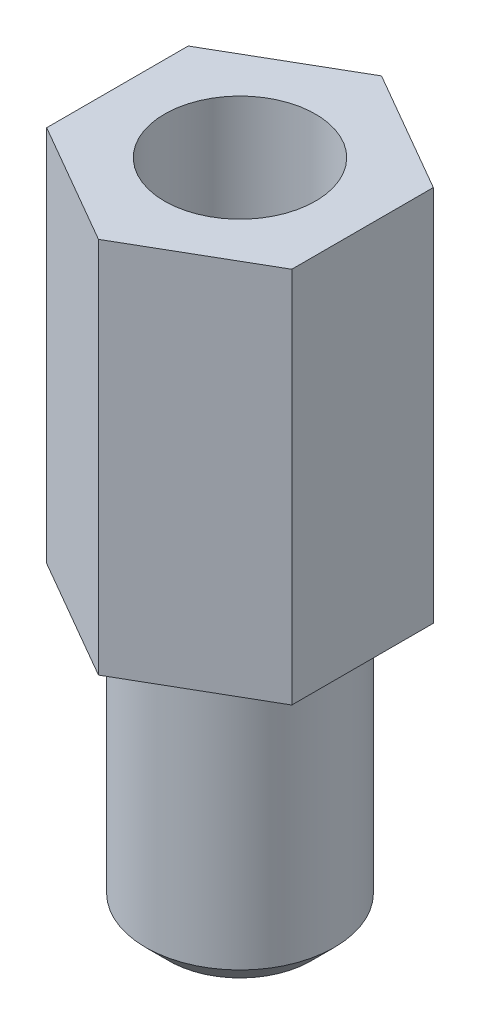
ISO-10303-21;
HEADER;
FILE_DESCRIPTION(('STEP AP214'),'2;1');
FILE_NAME('part.step','',(''),(''),'','','');
FILE_SCHEMA(('AUTOMOTIVE_DESIGN { 1 0 10303 214 1 1 1 1 }'));
ENDSEC;
DATA;
#1=APPLICATION_CONTEXT('core data for automotive mechanical design processes');
#2=APPLICATION_PROTOCOL_DEFINITION('international standard','automotive_design',2000,#1);
#3=PRODUCT_CONTEXT('',#1,'mechanical');
#4=PRODUCT('Part','Part','',(#3));
#5=PRODUCT_RELATED_PRODUCT_CATEGORY('part','',(#4));
#6=PRODUCT_DEFINITION_FORMATION('','',#4);
#7=PRODUCT_DEFINITION_CONTEXT('part definition',#1,'design');
#8=PRODUCT_DEFINITION('design','',#6,#7);
#9=PRODUCT_DEFINITION_SHAPE('','',#8);
#10=(LENGTH_UNIT() NAMED_UNIT(*) SI_UNIT(.MILLI.,.METRE.));
#11=(NAMED_UNIT(*) PLANE_ANGLE_UNIT() SI_UNIT($,.RADIAN.));
#12=(NAMED_UNIT(*) SI_UNIT($,.STERADIAN.) SOLID_ANGLE_UNIT());
#13=UNCERTAINTY_MEASURE_WITH_UNIT(LENGTH_MEASURE(1.E-05),#10,'distance_accuracy_value','');
#14=(GEOMETRIC_REPRESENTATION_CONTEXT(3) GLOBAL_UNCERTAINTY_ASSIGNED_CONTEXT((#13)) GLOBAL_UNIT_ASSIGNED_CONTEXT((#10,
#11,#12)) REPRESENTATION_CONTEXT('',''));
#15=CARTESIAN_POINT('',(0.,0.,0.));
#16=DIRECTION('',(0.,0.,1.));
#17=DIRECTION('',(1.,0.,0.));
#18=AXIS2_PLACEMENT_3D('',#15,#16,#17);
#19=CARTESIAN_POINT('',(0.,4.,1.5));
#20=DIRECTION('',(-0.5,0.,-0.866025403784439));
#21=DIRECTION('',(-0.866025403784439,0.,0.5));
#22=AXIS2_PLACEMENT_3D('',#19,#20,#21);
#23=PLANE('',#22);
#24=DIRECTION('',(0.866025403784439,0.,-0.5));
#25=VECTOR('',#24,1.);
#26=CARTESIAN_POINT('',(0.,0.,1.5));
#27=LINE('',#26,#25);
#28=CARTESIAN_POINT('',(0.,0.,1.5));
#29=VERTEX_POINT('',#28);
#30=CARTESIAN_POINT('',(1.29903810567666,0.,0.75));
#31=VERTEX_POINT('',#30);
#32=EDGE_CURVE('E130',#29,#31,#27,.T.);
#33=ORIENTED_EDGE('',*,*,#32,.T.);
#34=DIRECTION('',(0.,-1.,0.));
#35=VECTOR('',#34,1.);
#36=CARTESIAN_POINT('',(1.29903810567666,4.,0.75));
#37=LINE('',#36,#35);
#38=CARTESIAN_POINT('',(1.29903810567666,4.,0.75));
#39=VERTEX_POINT('',#38);
#40=EDGE_CURVE('E148',#39,#31,#37,.T.);
#41=ORIENTED_EDGE('',*,*,#40,.F.);
#42=DIRECTION('',(0.866025403784439,0.,-0.5));
#43=VECTOR('',#42,1.);
#44=CARTESIAN_POINT('',(0.,4.,1.5));
#45=LINE('',#44,#43);
#46=CARTESIAN_POINT('',(0.,4.,1.5));
#47=VERTEX_POINT('',#46);
#48=EDGE_CURVE('E141',#47,#39,#45,.T.);
#49=ORIENTED_EDGE('',*,*,#48,.F.);
#50=DIRECTION('',(0.,-1.,0.));
#51=VECTOR('',#50,1.);
#52=CARTESIAN_POINT('',(0.,4.,1.5));
#53=LINE('',#52,#51);
#54=EDGE_CURVE('E126',#47,#29,#53,.T.);
#55=ORIENTED_EDGE('',*,*,#54,.T.);
#56=EDGE_LOOP('',(#33,#41,#49,#55));
#57=FACE_BOUND('',#56,.T.);
#58=ADVANCED_FACE('F41',(#57),#23,.F.);
#59=CARTESIAN_POINT('',(1.29903810567666,4.,0.75));
#60=DIRECTION('',(-1.,0.,0.));
#61=DIRECTION('',(0.,0.,1.));
#62=AXIS2_PLACEMENT_3D('',#59,#60,#61);
#63=PLANE('',#62);
#64=DIRECTION('',(0.,0.,-1.));
#65=VECTOR('',#64,1.);
#66=CARTESIAN_POINT('',(1.29903810567666,0.,0.75));
#67=LINE('',#66,#65);
#68=CARTESIAN_POINT('',(1.29903810567666,0.,-0.750000000000002));
#69=VERTEX_POINT('',#68);
#70=EDGE_CURVE('E133',#31,#69,#67,.T.);
#71=ORIENTED_EDGE('',*,*,#70,.T.);
#72=DIRECTION('',(0.,-1.,0.));
#73=VECTOR('',#72,1.);
#74=CARTESIAN_POINT('',(1.29903810567666,4.,-0.750000000000002));
#75=LINE('',#74,#73);
#76=CARTESIAN_POINT('',(1.29903810567666,4.,-0.750000000000002));
#77=VERTEX_POINT('',#76);
#78=EDGE_CURVE('E145',#77,#69,#75,.T.);
#79=ORIENTED_EDGE('',*,*,#78,.F.);
#80=DIRECTION('',(0.,0.,-1.));
#81=VECTOR('',#80,1.);
#82=CARTESIAN_POINT('',(1.29903810567666,4.,0.75));
#83=LINE('',#82,#81);
#84=EDGE_CURVE('E98',#39,#77,#83,.T.);
#85=ORIENTED_EDGE('',*,*,#84,.F.);
#86=ORIENTED_EDGE('',*,*,#40,.T.);
#87=EDGE_LOOP('',(#71,#79,#85,#86));
#88=FACE_BOUND('',#87,.T.);
#89=ADVANCED_FACE('F163',(#88),#63,.F.);
#90=CARTESIAN_POINT('',(1.29903810567666,4.,-0.750000000000002));
#91=DIRECTION('',(-0.5,0.,0.866025403784439));
#92=DIRECTION('',(0.866025403784439,0.,0.5));
#93=AXIS2_PLACEMENT_3D('',#90,#91,#92);
#94=PLANE('',#93);
#95=DIRECTION('',(-0.866025403784439,0.,-0.5));
#96=VECTOR('',#95,1.);
#97=CARTESIAN_POINT('',(1.29903810567666,0.,-0.750000000000002));
#98=LINE('',#97,#96);
#99=CARTESIAN_POINT('',(0.,0.,-1.5));
#100=VERTEX_POINT('',#99);
#101=EDGE_CURVE('E136',#69,#100,#98,.T.);
#102=ORIENTED_EDGE('',*,*,#101,.T.);
#103=DIRECTION('',(0.,-1.,0.));
#104=VECTOR('',#103,1.);
#105=CARTESIAN_POINT('',(0.,4.,-1.5));
#106=LINE('',#105,#104);
#107=CARTESIAN_POINT('',(0.,4.,-1.5));
#108=VERTEX_POINT('',#107);
#109=EDGE_CURVE('E121',#108,#100,#106,.T.);
#110=ORIENTED_EDGE('',*,*,#109,.F.);
#111=DIRECTION('',(-0.866025403784439,0.,-0.5));
#112=VECTOR('',#111,1.);
#113=CARTESIAN_POINT('',(1.29903810567666,4.,-0.750000000000002));
#114=LINE('',#113,#112);
#115=EDGE_CURVE('E112',#77,#108,#114,.T.);
#116=ORIENTED_EDGE('',*,*,#115,.F.);
#117=ORIENTED_EDGE('',*,*,#78,.T.);
#118=EDGE_LOOP('',(#102,#110,#116,#117));
#119=FACE_BOUND('',#118,.T.);
#120=ADVANCED_FACE('F166',(#119),#94,.F.);
#121=CARTESIAN_POINT('',(0.,4.,-1.5));
#122=DIRECTION('',(0.5,0.,0.866025403784439));
#123=DIRECTION('',(0.866025403784439,0.,-0.5));
#124=AXIS2_PLACEMENT_3D('',#121,#122,#123);
#125=PLANE('',#124);
#126=DIRECTION('',(-0.866025403784439,0.,0.5));
#127=VECTOR('',#126,1.);
#128=CARTESIAN_POINT('',(0.,0.,-1.5));
#129=LINE('',#128,#127);
#130=CARTESIAN_POINT('',(-1.29903810567666,0.,-0.750000000000001));
#131=VERTEX_POINT('',#130);
#132=EDGE_CURVE('E120',#100,#131,#129,.T.);
#133=ORIENTED_EDGE('',*,*,#132,.T.);
#134=DIRECTION('',(0.,-1.,0.));
#135=VECTOR('',#134,1.);
#136=CARTESIAN_POINT('',(-1.29903810567666,4.,-0.750000000000001));
#137=LINE('',#136,#135);
#138=CARTESIAN_POINT('',(-1.29903810567666,4.,-0.750000000000001));
#139=VERTEX_POINT('',#138);
#140=EDGE_CURVE('E117',#139,#131,#137,.T.);
#141=ORIENTED_EDGE('',*,*,#140,.F.);
#142=DIRECTION('',(-0.866025403784439,0.,0.5));
#143=VECTOR('',#142,1.);
#144=CARTESIAN_POINT('',(0.,4.,-1.5));
#145=LINE('',#144,#143);
#146=EDGE_CURVE('E106',#108,#139,#145,.T.);
#147=ORIENTED_EDGE('',*,*,#146,.F.);
#148=ORIENTED_EDGE('',*,*,#109,.T.);
#149=EDGE_LOOP('',(#133,#141,#147,#148));
#150=FACE_BOUND('',#149,.T.);
#151=ADVANCED_FACE('F118',(#150),#125,.F.);
#152=CARTESIAN_POINT('',(-1.29903810567666,4.,-0.750000000000001));
#153=DIRECTION('',(1.,0.,0.));
#154=DIRECTION('',(0.,0.,-1.));
#155=AXIS2_PLACEMENT_3D('',#152,#153,#154);
#156=PLANE('',#155);
#157=DIRECTION('',(0.,0.,1.));
#158=VECTOR('',#157,1.);
#159=CARTESIAN_POINT('',(-1.29903810567666,0.,-0.750000000000001));
#160=LINE('',#159,#158);
#161=CARTESIAN_POINT('',(-1.29903810567666,0.,0.75));
#162=VERTEX_POINT('',#161);
#163=EDGE_CURVE('E83',#131,#162,#160,.T.);
#164=ORIENTED_EDGE('',*,*,#163,.T.);
#165=DIRECTION('',(0.,-1.,0.));
#166=VECTOR('',#165,1.);
#167=CARTESIAN_POINT('',(-1.29903810567666,4.,0.75));
#168=LINE('',#167,#166);
#169=CARTESIAN_POINT('',(-1.29903810567666,4.,0.75));
#170=VERTEX_POINT('',#169);
#171=EDGE_CURVE('E122',#170,#162,#168,.T.);
#172=ORIENTED_EDGE('',*,*,#171,.F.);
#173=DIRECTION('',(0.,0.,1.));
#174=VECTOR('',#173,1.);
#175=CARTESIAN_POINT('',(-1.29903810567666,4.,-0.750000000000001));
#176=LINE('',#175,#174);
#177=EDGE_CURVE('E110',#139,#170,#176,.T.);
#178=ORIENTED_EDGE('',*,*,#177,.F.);
#179=ORIENTED_EDGE('',*,*,#140,.T.);
#180=EDGE_LOOP('',(#164,#172,#178,#179));
#181=FACE_BOUND('',#180,.T.);
#182=ADVANCED_FACE('F124',(#181),#156,.F.);
#183=CARTESIAN_POINT('',(-1.29903810567666,4.,0.75));
#184=DIRECTION('',(0.5,0.,-0.866025403784439));
#185=DIRECTION('',(-0.866025403784439,0.,-0.5));
#186=AXIS2_PLACEMENT_3D('',#183,#184,#185);
#187=PLANE('',#186);
#188=DIRECTION('',(0.866025403784439,0.,0.5));
#189=VECTOR('',#188,1.);
#190=CARTESIAN_POINT('',(-1.29903810567666,0.,0.75));
#191=LINE('',#190,#189);
#192=EDGE_CURVE('E89',#162,#29,#191,.T.);
#193=ORIENTED_EDGE('',*,*,#192,.T.);
#194=ORIENTED_EDGE('',*,*,#54,.F.);
#195=DIRECTION('',(0.866025403784439,0.,0.5));
#196=VECTOR('',#195,1.);
#197=CARTESIAN_POINT('',(-1.29903810567666,4.,0.75));
#198=LINE('',#197,#196);
#199=EDGE_CURVE('E59',#170,#47,#198,.T.);
#200=ORIENTED_EDGE('',*,*,#199,.F.);
#201=ORIENTED_EDGE('',*,*,#171,.T.);
#202=EDGE_LOOP('',(#193,#194,#200,#201));
#203=FACE_BOUND('',#202,.T.);
#204=ADVANCED_FACE('F171',(#203),#187,.F.);
#205=CARTESIAN_POINT('',(0.,4.,0.));
#206=DIRECTION('',(0.,1.,0.));
#207=DIRECTION('',(0.,0.,1.));
#208=AXIS2_PLACEMENT_3D('',#205,#206,#207);
#209=PLANE('',#208);
#210=CARTESIAN_POINT('',(0.,4.,0.));
#211=DIRECTION('',(0.,1.,0.));
#212=DIRECTION('',(0.,0.,1.));
#213=AXIS2_PLACEMENT_3D('',#210,#211,#212);
#214=CIRCLE('',#213,0.79999999999999);
#215=CARTESIAN_POINT('',(0.,4.,0.79999999999999));
#216=VERTEX_POINT('',#215);
#217=EDGE_CURVE('E283',#216,#216,#214,.T.);
#218=ORIENTED_EDGE('',*,*,#217,.F.);
#219=EDGE_LOOP('',(#218));
#220=FACE_BOUND('',#219,.T.);
#221=ORIENTED_EDGE('',*,*,#48,.T.);
#222=ORIENTED_EDGE('',*,*,#84,.T.);
#223=ORIENTED_EDGE('',*,*,#115,.T.);
#224=ORIENTED_EDGE('',*,*,#146,.T.);
#225=ORIENTED_EDGE('',*,*,#177,.T.);
#226=ORIENTED_EDGE('',*,*,#199,.T.);
#227=EDGE_LOOP('',(#221,#222,#223,#224,#225,#226));
#228=FACE_BOUND('',#227,.T.);
#229=ADVANCED_FACE('F108',(#220,#228),#209,.T.);
#230=CARTESIAN_POINT('',(0.,0.,0.));
#231=DIRECTION('',(0.,1.,0.));
#232=DIRECTION('',(0.,0.,1.));
#233=AXIS2_PLACEMENT_3D('',#230,#231,#232);
#234=PLANE('',#233);
#235=CARTESIAN_POINT('',(0.,0.,0.));
#236=DIRECTION('',(0.,-1.,0.));
#237=DIRECTION('',(0.,0.,-1.));
#238=AXIS2_PLACEMENT_3D('',#235,#236,#237);
#239=CIRCLE('',#238,1.);
#240=CARTESIAN_POINT('',(0.,0.,-1.));
#241=VERTEX_POINT('',#240);
#242=EDGE_CURVE('E149',#241,#241,#239,.T.);
#243=ORIENTED_EDGE('',*,*,#242,.F.);
#244=EDGE_LOOP('',(#243));
#245=FACE_BOUND('',#244,.T.);
#246=ORIENTED_EDGE('',*,*,#32,.F.);
#247=ORIENTED_EDGE('',*,*,#192,.F.);
#248=ORIENTED_EDGE('',*,*,#163,.F.);
#249=ORIENTED_EDGE('',*,*,#132,.F.);
#250=ORIENTED_EDGE('',*,*,#101,.F.);
#251=ORIENTED_EDGE('',*,*,#70,.F.);
#252=EDGE_LOOP('',(#246,#247,#248,#249,#250,#251));
#253=FACE_BOUND('',#252,.T.);
#254=ADVANCED_FACE('F169',(#245,#253),#234,.F.);
#255=CARTESIAN_POINT('',(0.,-3.,0.));
#256=DIRECTION('',(0.,1.,0.));
#257=DIRECTION('',(0.,0.,1.));
#258=AXIS2_PLACEMENT_3D('',#255,#256,#257);
#259=CYLINDRICAL_SURFACE('',#258,1.);
#260=CARTESIAN_POINT('',(0.,-2.75,0.));
#261=DIRECTION('',(0.,-1.,0.));
#262=DIRECTION('',(0.,0.,-1.));
#263=AXIS2_PLACEMENT_3D('',#260,#261,#262);
#264=CIRCLE('',#263,1.);
#265=CARTESIAN_POINT('',(0.,-2.75,-1.));
#266=VERTEX_POINT('',#265);
#267=EDGE_CURVE('E11',#266,#266,#264,.F.);
#268=ORIENTED_EDGE('',*,*,#267,.T.);
#269=EDGE_LOOP('',(#268));
#270=FACE_BOUND('',#269,.T.);
#271=ORIENTED_EDGE('',*,*,#242,.T.);
#272=EDGE_LOOP('',(#271));
#273=FACE_BOUND('',#272,.T.);
#274=ADVANCED_FACE('F213',(#270,#273),#259,.T.);
#275=CARTESIAN_POINT('',(0.,-3.,0.));
#276=DIRECTION('',(0.,-1.,0.));
#277=DIRECTION('',(0.,0.,-1.));
#278=AXIS2_PLACEMENT_3D('',#275,#276,#277);
#279=PLANE('',#278);
#280=CARTESIAN_POINT('',(0.,-3.,0.));
#281=DIRECTION('',(0.,-1.,0.));
#282=DIRECTION('',(0.,0.,-1.));
#283=AXIS2_PLACEMENT_3D('',#280,#281,#282);
#284=CIRCLE('',#283,0.75);
#285=CARTESIAN_POINT('',(0.,-3.,-0.75));
#286=VERTEX_POINT('',#285);
#287=EDGE_CURVE('E51',#286,#286,#284,.T.);
#288=ORIENTED_EDGE('',*,*,#287,.T.);
#289=EDGE_LOOP('',(#288));
#290=FACE_BOUND('',#289,.T.);
#291=ADVANCED_FACE('F222',(#290),#279,.T.);
#292=CARTESIAN_POINT('',(0.,-3.,0.));
#293=DIRECTION('',(0.,1.,0.));
#294=DIRECTION('',(0.,0.,1.));
#295=AXIS2_PLACEMENT_3D('',#292,#293,#294);
#296=CONICAL_SURFACE('',#295,0.75,0.785398163397447);
#297=ORIENTED_EDGE('',*,*,#267,.F.);
#298=EDGE_LOOP('',(#297));
#299=FACE_BOUND('',#298,.T.);
#300=ORIENTED_EDGE('',*,*,#287,.F.);
#301=EDGE_LOOP('',(#300));
#302=FACE_BOUND('',#301,.T.);
#303=ADVANCED_FACE('F44',(#299,#302),#296,.T.);
#304=CARTESIAN_POINT('',(0.,0.,0.));
#305=DIRECTION('',(0.,1.,0.));
#306=DIRECTION('',(0.,0.,1.));
#307=AXIS2_PLACEMENT_3D('',#304,#305,#306);
#308=CONICAL_SURFACE('',#307,0.799999999999999,1.02974425867665);
#309=CARTESIAN_POINT('',(0.,-0.480688495222049,0.));
#310=VERTEX_POINT('',#309);
#311=VERTEX_LOOP('',#310);
#312=FACE_BOUND('',#311,.T.);
#313=CARTESIAN_POINT('',(0.,0.,0.));
#314=DIRECTION('',(0.,1.,0.));
#315=DIRECTION('',(0.,0.,1.));
#316=AXIS2_PLACEMENT_3D('',#313,#314,#315);
#317=CIRCLE('',#316,0.799999999999999);
#318=CARTESIAN_POINT('',(0.,0.,0.799999999999999));
#319=VERTEX_POINT('',#318);
#320=EDGE_CURVE('E134',#319,#319,#317,.T.);
#321=ORIENTED_EDGE('',*,*,#320,.T.);
#322=EDGE_LOOP('',(#321));
#323=FACE_BOUND('',#322,.T.);
#324=ADVANCED_FACE('F240',(#312,#323),#308,.F.);
#325=CARTESIAN_POINT('',(0.,4.,0.));
#326=DIRECTION('',(0.,1.,0.));
#327=DIRECTION('',(0.,0.,1.));
#328=AXIS2_PLACEMENT_3D('',#325,#326,#327);
#329=CYLINDRICAL_SURFACE('',#328,0.799999999999994);
#330=ORIENTED_EDGE('',*,*,#320,.F.);
#331=EDGE_LOOP('',(#330));
#332=FACE_BOUND('',#331,.T.);
#333=ORIENTED_EDGE('',*,*,#217,.T.);
#334=EDGE_LOOP('',(#333));
#335=FACE_BOUND('',#334,.T.);
#336=ADVANCED_FACE('F257',(#332,#335),#329,.F.);
#337=CLOSED_SHELL('',(#58,#89,#120,#151,#182,#204,#229,#254,#274,#291,#303,#324,#336));
#338=MANIFOLD_SOLID_BREP('B2',#337);
#339=ADVANCED_BREP_SHAPE_REPRESENTATION('',(#18,#338),#14);
#340=SHAPE_DEFINITION_REPRESENTATION(#9,#339);
ENDSEC;
END-ISO-10303-21;
